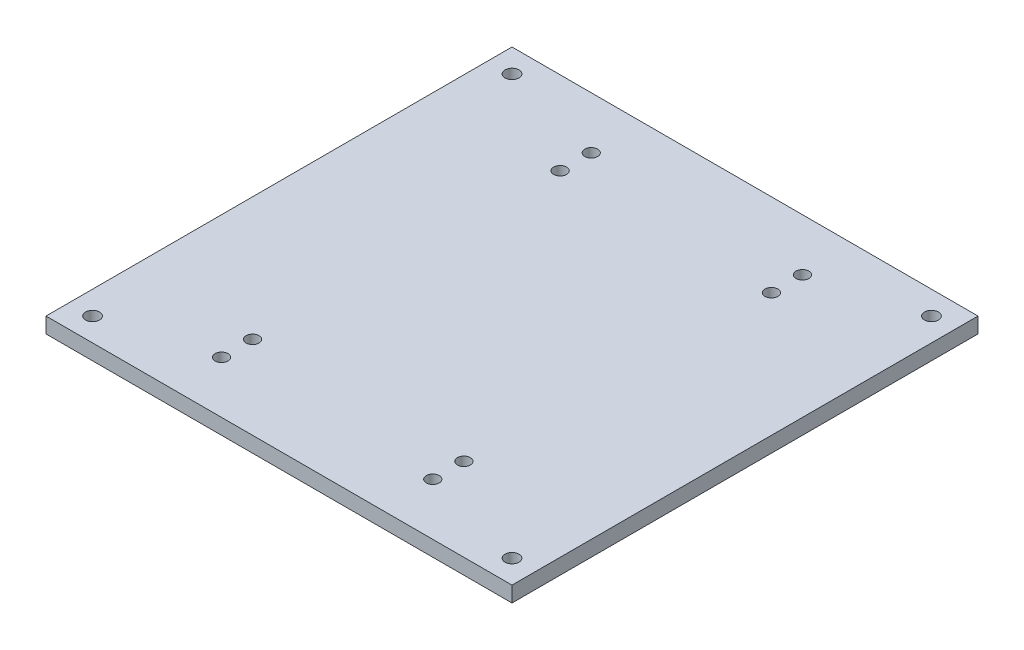
ISO-10303-21;
HEADER;
FILE_DESCRIPTION(('STEP AP214'),'2;1');
FILE_NAME('part.step','',(''),(''),'','','');
FILE_SCHEMA(('AUTOMOTIVE_DESIGN { 1 0 10303 214 1 1 1 1 }'));
ENDSEC;
DATA;
#1=APPLICATION_CONTEXT('core data for automotive mechanical design processes');
#2=APPLICATION_PROTOCOL_DEFINITION('international standard','automotive_design',2000,#1);
#3=PRODUCT_CONTEXT('',#1,'mechanical');
#4=PRODUCT('Part','Part','',(#3));
#5=PRODUCT_RELATED_PRODUCT_CATEGORY('part','',(#4));
#6=PRODUCT_DEFINITION_FORMATION('','',#4);
#7=PRODUCT_DEFINITION_CONTEXT('part definition',#1,'design');
#8=PRODUCT_DEFINITION('design','',#6,#7);
#9=PRODUCT_DEFINITION_SHAPE('','',#8);
#10=(LENGTH_UNIT() NAMED_UNIT(*) SI_UNIT(.MILLI.,.METRE.));
#11=(NAMED_UNIT(*) PLANE_ANGLE_UNIT() SI_UNIT($,.RADIAN.));
#12=(NAMED_UNIT(*) SI_UNIT($,.STERADIAN.) SOLID_ANGLE_UNIT());
#13=UNCERTAINTY_MEASURE_WITH_UNIT(LENGTH_MEASURE(1.E-05),#10,'distance_accuracy_value','');
#14=(GEOMETRIC_REPRESENTATION_CONTEXT(3) GLOBAL_UNCERTAINTY_ASSIGNED_CONTEXT((#13)) GLOBAL_UNIT_ASSIGNED_CONTEXT((#10,
#11,#12)) REPRESENTATION_CONTEXT('',''));
#15=CARTESIAN_POINT('',(0.,0.,0.));
#16=DIRECTION('',(0.,0.,1.));
#17=DIRECTION('',(1.,0.,0.));
#18=AXIS2_PLACEMENT_3D('',#15,#16,#17);
#19=CARTESIAN_POINT('',(-150.,10.,-150.));
#20=DIRECTION('',(1.,0.,0.));
#21=DIRECTION('',(0.,0.,-1.));
#22=AXIS2_PLACEMENT_3D('',#19,#20,#21);
#23=PLANE('',#22);
#24=DIRECTION('',(0.,0.,1.));
#25=VECTOR('',#24,1.);
#26=CARTESIAN_POINT('',(-150.,0.,-150.));
#27=LINE('',#26,#25);
#28=CARTESIAN_POINT('',(-150.,0.,-150.));
#29=VERTEX_POINT('',#28);
#30=CARTESIAN_POINT('',(-150.,0.,150.));
#31=VERTEX_POINT('',#30);
#32=EDGE_CURVE('E106',#29,#31,#27,.T.);
#33=ORIENTED_EDGE('',*,*,#32,.T.);
#34=DIRECTION('',(0.,-1.,0.));
#35=VECTOR('',#34,1.);
#36=CARTESIAN_POINT('',(-150.,10.,150.));
#37=LINE('',#36,#35);
#38=CARTESIAN_POINT('',(-150.,10.,150.));
#39=VERTEX_POINT('',#38);
#40=EDGE_CURVE('E11',#39,#31,#37,.T.);
#41=ORIENTED_EDGE('',*,*,#40,.F.);
#42=DIRECTION('',(0.,0.,1.));
#43=VECTOR('',#42,1.);
#44=CARTESIAN_POINT('',(-150.,10.,-150.));
#45=LINE('',#44,#43);
#46=CARTESIAN_POINT('',(-150.,10.,-150.));
#47=VERTEX_POINT('',#46);
#48=EDGE_CURVE('E94',#47,#39,#45,.T.);
#49=ORIENTED_EDGE('',*,*,#48,.F.);
#50=DIRECTION('',(0.,-1.,0.));
#51=VECTOR('',#50,1.);
#52=CARTESIAN_POINT('',(-150.,10.,-150.));
#53=LINE('',#52,#51);
#54=EDGE_CURVE('E102',#47,#29,#53,.T.);
#55=ORIENTED_EDGE('',*,*,#54,.T.);
#56=EDGE_LOOP('',(#33,#41,#49,#55));
#57=FACE_BOUND('',#56,.T.);
#58=ADVANCED_FACE('F43',(#57),#23,.F.);
#59=CARTESIAN_POINT('',(-150.,10.,150.));
#60=DIRECTION('',(0.,0.,-1.));
#61=DIRECTION('',(-1.,0.,0.));
#62=AXIS2_PLACEMENT_3D('',#59,#60,#61);
#63=PLANE('',#62);
#64=DIRECTION('',(1.,0.,0.));
#65=VECTOR('',#64,1.);
#66=CARTESIAN_POINT('',(-150.,0.,150.));
#67=LINE('',#66,#65);
#68=CARTESIAN_POINT('',(150.,0.,150.));
#69=VERTEX_POINT('',#68);
#70=EDGE_CURVE('E98',#31,#69,#67,.T.);
#71=ORIENTED_EDGE('',*,*,#70,.T.);
#72=DIRECTION('',(0.,-1.,0.));
#73=VECTOR('',#72,1.);
#74=CARTESIAN_POINT('',(150.,10.,150.));
#75=LINE('',#74,#73);
#76=CARTESIAN_POINT('',(150.,10.,150.));
#77=VERTEX_POINT('',#76);
#78=EDGE_CURVE('E51',#77,#69,#75,.T.);
#79=ORIENTED_EDGE('',*,*,#78,.F.);
#80=DIRECTION('',(1.,0.,0.));
#81=VECTOR('',#80,1.);
#82=CARTESIAN_POINT('',(-150.,10.,150.));
#83=LINE('',#82,#81);
#84=EDGE_CURVE('E89',#39,#77,#83,.T.);
#85=ORIENTED_EDGE('',*,*,#84,.F.);
#86=ORIENTED_EDGE('',*,*,#40,.T.);
#87=EDGE_LOOP('',(#71,#79,#85,#86));
#88=FACE_BOUND('',#87,.T.);
#89=ADVANCED_FACE('F97',(#88),#63,.F.);
#90=CARTESIAN_POINT('',(150.,10.,-150.));
#91=DIRECTION('',(-1.,0.,0.));
#92=DIRECTION('',(0.,0.,1.));
#93=AXIS2_PLACEMENT_3D('',#90,#91,#92);
#94=PLANE('',#93);
#95=DIRECTION('',(0.,0.,-1.));
#96=VECTOR('',#95,1.);
#97=CARTESIAN_POINT('',(150.,0.,-150.));
#98=LINE('',#97,#96);
#99=CARTESIAN_POINT('',(150.,0.,-150.));
#100=VERTEX_POINT('',#99);
#101=EDGE_CURVE('E76',#69,#100,#98,.T.);
#102=ORIENTED_EDGE('',*,*,#101,.T.);
#103=DIRECTION('',(0.,-1.,0.));
#104=VECTOR('',#103,1.);
#105=CARTESIAN_POINT('',(150.,10.,-150.));
#106=LINE('',#105,#104);
#107=CARTESIAN_POINT('',(150.,10.,-150.));
#108=VERTEX_POINT('',#107);
#109=EDGE_CURVE('E99',#108,#100,#106,.T.);
#110=ORIENTED_EDGE('',*,*,#109,.F.);
#111=DIRECTION('',(0.,0.,-1.));
#112=VECTOR('',#111,1.);
#113=CARTESIAN_POINT('',(150.,10.,-150.));
#114=LINE('',#113,#112);
#115=EDGE_CURVE('E92',#77,#108,#114,.T.);
#116=ORIENTED_EDGE('',*,*,#115,.F.);
#117=ORIENTED_EDGE('',*,*,#78,.T.);
#118=EDGE_LOOP('',(#102,#110,#116,#117));
#119=FACE_BOUND('',#118,.T.);
#120=ADVANCED_FACE('F100',(#119),#94,.F.);
#121=CARTESIAN_POINT('',(-150.,10.,-150.));
#122=DIRECTION('',(0.,0.,1.));
#123=DIRECTION('',(1.,0.,0.));
#124=AXIS2_PLACEMENT_3D('',#121,#122,#123);
#125=PLANE('',#124);
#126=DIRECTION('',(-1.,0.,0.));
#127=VECTOR('',#126,1.);
#128=CARTESIAN_POINT('',(-150.,0.,-150.));
#129=LINE('',#128,#127);
#130=EDGE_CURVE('E82',#100,#29,#129,.T.);
#131=ORIENTED_EDGE('',*,*,#130,.T.);
#132=ORIENTED_EDGE('',*,*,#54,.F.);
#133=DIRECTION('',(-1.,0.,0.));
#134=VECTOR('',#133,1.);
#135=CARTESIAN_POINT('',(-150.,10.,-150.));
#136=LINE('',#135,#134);
#137=EDGE_CURVE('E59',#108,#47,#136,.T.);
#138=ORIENTED_EDGE('',*,*,#137,.F.);
#139=ORIENTED_EDGE('',*,*,#109,.T.);
#140=EDGE_LOOP('',(#131,#132,#138,#139));
#141=FACE_BOUND('',#140,.T.);
#142=ADVANCED_FACE('F114',(#141),#125,.F.);
#143=CARTESIAN_POINT('',(0.,10.,0.));
#144=DIRECTION('',(0.,1.,0.));
#145=DIRECTION('',(0.,0.,1.));
#146=AXIS2_PLACEMENT_3D('',#143,#144,#145);
#147=PLANE('',#146);
#148=CARTESIAN_POINT('',(-135.,10.,135.));
#149=DIRECTION('',(0.,1.,0.));
#150=DIRECTION('',(0.,0.,1.));
#151=AXIS2_PLACEMENT_3D('',#148,#149,#150);
#152=CIRCLE('',#151,4.5);
#153=CARTESIAN_POINT('',(-135.,10.,139.5));
#154=VERTEX_POINT('',#153);
#155=EDGE_CURVE('E188',#154,#154,#152,.T.);
#156=ORIENTED_EDGE('',*,*,#155,.F.);
#157=EDGE_LOOP('',(#156));
#158=FACE_BOUND('',#157,.T.);
#159=CARTESIAN_POINT('',(-135.,10.,-135.));
#160=DIRECTION('',(0.,1.,0.));
#161=DIRECTION('',(0.,0.,1.));
#162=AXIS2_PLACEMENT_3D('',#159,#160,#161);
#163=CIRCLE('',#162,4.5);
#164=CARTESIAN_POINT('',(-135.,10.,-130.5));
#165=VERTEX_POINT('',#164);
#166=EDGE_CURVE('E182',#165,#165,#163,.T.);
#167=ORIENTED_EDGE('',*,*,#166,.F.);
#168=EDGE_LOOP('',(#167));
#169=FACE_BOUND('',#168,.T.);
#170=CARTESIAN_POINT('',(135.,10.,-135.));
#171=DIRECTION('',(0.,1.,0.));
#172=DIRECTION('',(0.,0.,1.));
#173=AXIS2_PLACEMENT_3D('',#170,#171,#172);
#174=CIRCLE('',#173,4.5);
#175=CARTESIAN_POINT('',(135.,10.,-130.5));
#176=VERTEX_POINT('',#175);
#177=EDGE_CURVE('E176',#176,#176,#174,.T.);
#178=ORIENTED_EDGE('',*,*,#177,.F.);
#179=EDGE_LOOP('',(#178));
#180=FACE_BOUND('',#179,.T.);
#181=CARTESIAN_POINT('',(135.,10.,135.));
#182=DIRECTION('',(0.,1.,0.));
#183=DIRECTION('',(0.,0.,1.));
#184=AXIS2_PLACEMENT_3D('',#181,#182,#183);
#185=CIRCLE('',#184,4.5);
#186=CARTESIAN_POINT('',(135.,10.,139.5));
#187=VERTEX_POINT('',#186);
#188=EDGE_CURVE('E170',#187,#187,#185,.T.);
#189=ORIENTED_EDGE('',*,*,#188,.F.);
#190=EDGE_LOOP('',(#189));
#191=FACE_BOUND('',#190,.T.);
#192=CARTESIAN_POINT('',(70.5,10.,-116.5));
#193=DIRECTION('',(0.,1.,0.));
#194=DIRECTION('',(0.,0.,1.));
#195=AXIS2_PLACEMENT_3D('',#192,#193,#194);
#196=CIRCLE('',#195,4.14999999999999);
#197=CARTESIAN_POINT('',(70.5,10.,-112.35));
#198=VERTEX_POINT('',#197);
#199=EDGE_CURVE('E164',#198,#198,#196,.T.);
#200=ORIENTED_EDGE('',*,*,#199,.F.);
#201=EDGE_LOOP('',(#200));
#202=FACE_BOUND('',#201,.T.);
#203=CARTESIAN_POINT('',(70.5,10.,-96.5000000000002));
#204=DIRECTION('',(0.,1.,0.));
#205=DIRECTION('',(0.,0.,1.));
#206=AXIS2_PLACEMENT_3D('',#203,#204,#205);
#207=CIRCLE('',#206,4.14999999999999);
#208=CARTESIAN_POINT('',(70.5,10.,-92.3500000000002));
#209=VERTEX_POINT('',#208);
#210=EDGE_CURVE('E158',#209,#209,#207,.T.);
#211=ORIENTED_EDGE('',*,*,#210,.F.);
#212=EDGE_LOOP('',(#211));
#213=FACE_BOUND('',#212,.T.);
#214=CARTESIAN_POINT('',(65.5,10.,96.4999999999988));
#215=DIRECTION('',(0.,1.,0.));
#216=DIRECTION('',(0.,0.,1.));
#217=AXIS2_PLACEMENT_3D('',#214,#215,#216);
#218=CIRCLE('',#217,4.14999999999999);
#219=CARTESIAN_POINT('',(65.5,10.,100.649999999999));
#220=VERTEX_POINT('',#219);
#221=EDGE_CURVE('E152',#220,#220,#218,.T.);
#222=ORIENTED_EDGE('',*,*,#221,.F.);
#223=EDGE_LOOP('',(#222));
#224=FACE_BOUND('',#223,.T.);
#225=CARTESIAN_POINT('',(65.5,10.,116.499999999999));
#226=DIRECTION('',(0.,1.,0.));
#227=DIRECTION('',(0.,0.,1.));
#228=AXIS2_PLACEMENT_3D('',#225,#226,#227);
#229=CIRCLE('',#228,4.14999999999999);
#230=CARTESIAN_POINT('',(65.5,10.,120.649999999999));
#231=VERTEX_POINT('',#230);
#232=EDGE_CURVE('E146',#231,#231,#229,.T.);
#233=ORIENTED_EDGE('',*,*,#232,.F.);
#234=EDGE_LOOP('',(#233));
#235=FACE_BOUND('',#234,.T.);
#236=CARTESIAN_POINT('',(-65.5000000000008,10.,-116.500000000002));
#237=DIRECTION('',(0.,1.,0.));
#238=DIRECTION('',(0.,0.,1.));
#239=AXIS2_PLACEMENT_3D('',#236,#237,#238);
#240=CIRCLE('',#239,4.14999999999999);
#241=CARTESIAN_POINT('',(-65.5000000000008,10.,-112.350000000002));
#242=VERTEX_POINT('',#241);
#243=EDGE_CURVE('E140',#242,#242,#240,.T.);
#244=ORIENTED_EDGE('',*,*,#243,.F.);
#245=EDGE_LOOP('',(#244));
#246=FACE_BOUND('',#245,.T.);
#247=CARTESIAN_POINT('',(-65.5000000000007,10.,-96.500000000002));
#248=DIRECTION('',(0.,1.,0.));
#249=DIRECTION('',(0.,0.,1.));
#250=AXIS2_PLACEMENT_3D('',#247,#248,#249);
#251=CIRCLE('',#250,4.14999999999999);
#252=CARTESIAN_POINT('',(-65.5000000000007,10.,-92.3500000000021));
#253=VERTEX_POINT('',#252);
#254=EDGE_CURVE('E134',#253,#253,#251,.T.);
#255=ORIENTED_EDGE('',*,*,#254,.F.);
#256=EDGE_LOOP('',(#255));
#257=FACE_BOUND('',#256,.T.);
#258=CARTESIAN_POINT('',(-70.4999999999993,10.,96.4999999999969));
#259=DIRECTION('',(0.,1.,0.));
#260=DIRECTION('',(0.,0.,1.));
#261=AXIS2_PLACEMENT_3D('',#258,#259,#260);
#262=CIRCLE('',#261,4.14999999999999);
#263=CARTESIAN_POINT('',(-70.4999999999993,10.,100.649999999997));
#264=VERTEX_POINT('',#263);
#265=EDGE_CURVE('E128',#264,#264,#262,.T.);
#266=ORIENTED_EDGE('',*,*,#265,.F.);
#267=EDGE_LOOP('',(#266));
#268=FACE_BOUND('',#267,.T.);
#269=CARTESIAN_POINT('',(-70.4999999999992,10.,116.499999999997));
#270=DIRECTION('',(0.,1.,0.));
#271=DIRECTION('',(0.,0.,1.));
#272=AXIS2_PLACEMENT_3D('',#269,#270,#271);
#273=CIRCLE('',#272,4.14999999999999);
#274=CARTESIAN_POINT('',(-70.4999999999992,10.,120.649999999997));
#275=VERTEX_POINT('',#274);
#276=EDGE_CURVE('E122',#275,#275,#273,.T.);
#277=ORIENTED_EDGE('',*,*,#276,.F.);
#278=EDGE_LOOP('',(#277));
#279=FACE_BOUND('',#278,.T.);
#280=ORIENTED_EDGE('',*,*,#48,.T.);
#281=ORIENTED_EDGE('',*,*,#84,.T.);
#282=ORIENTED_EDGE('',*,*,#115,.T.);
#283=ORIENTED_EDGE('',*,*,#137,.T.);
#284=EDGE_LOOP('',(#280,#281,#282,#283));
#285=FACE_BOUND('',#284,.T.);
#286=ADVANCED_FACE('F90',(#158,#169,#180,#191,#202,#213,#224,#235,#246,#257,#268,#279,#285),
#147,.T.);
#287=CARTESIAN_POINT('',(0.,0.,0.));
#288=DIRECTION('',(0.,1.,0.));
#289=DIRECTION('',(0.,0.,1.));
#290=AXIS2_PLACEMENT_3D('',#287,#288,#289);
#291=PLANE('',#290);
#292=CARTESIAN_POINT('',(-135.,0.,135.));
#293=DIRECTION('',(0.,1.,0.));
#294=DIRECTION('',(0.,0.,1.));
#295=AXIS2_PLACEMENT_3D('',#292,#293,#294);
#296=CIRCLE('',#295,4.5);
#297=CARTESIAN_POINT('',(-135.,0.,139.5));
#298=VERTEX_POINT('',#297);
#299=EDGE_CURVE('E185',#298,#298,#296,.T.);
#300=ORIENTED_EDGE('',*,*,#299,.T.);
#301=EDGE_LOOP('',(#300));
#302=FACE_BOUND('',#301,.T.);
#303=CARTESIAN_POINT('',(-135.,0.,-135.));
#304=DIRECTION('',(0.,1.,0.));
#305=DIRECTION('',(0.,0.,1.));
#306=AXIS2_PLACEMENT_3D('',#303,#304,#305);
#307=CIRCLE('',#306,4.5);
#308=CARTESIAN_POINT('',(-135.,0.,-130.5));
#309=VERTEX_POINT('',#308);
#310=EDGE_CURVE('E179',#309,#309,#307,.T.);
#311=ORIENTED_EDGE('',*,*,#310,.T.);
#312=EDGE_LOOP('',(#311));
#313=FACE_BOUND('',#312,.T.);
#314=CARTESIAN_POINT('',(135.,0.,-135.));
#315=DIRECTION('',(0.,1.,0.));
#316=DIRECTION('',(0.,0.,1.));
#317=AXIS2_PLACEMENT_3D('',#314,#315,#316);
#318=CIRCLE('',#317,4.5);
#319=CARTESIAN_POINT('',(135.,0.,-130.5));
#320=VERTEX_POINT('',#319);
#321=EDGE_CURVE('E173',#320,#320,#318,.T.);
#322=ORIENTED_EDGE('',*,*,#321,.T.);
#323=EDGE_LOOP('',(#322));
#324=FACE_BOUND('',#323,.T.);
#325=CARTESIAN_POINT('',(135.,0.,135.));
#326=DIRECTION('',(0.,1.,0.));
#327=DIRECTION('',(0.,0.,1.));
#328=AXIS2_PLACEMENT_3D('',#325,#326,#327);
#329=CIRCLE('',#328,4.5);
#330=CARTESIAN_POINT('',(135.,0.,139.5));
#331=VERTEX_POINT('',#330);
#332=EDGE_CURVE('E167',#331,#331,#329,.T.);
#333=ORIENTED_EDGE('',*,*,#332,.T.);
#334=EDGE_LOOP('',(#333));
#335=FACE_BOUND('',#334,.T.);
#336=CARTESIAN_POINT('',(70.5,0.,-116.5));
#337=DIRECTION('',(0.,1.,0.));
#338=DIRECTION('',(0.,0.,1.));
#339=AXIS2_PLACEMENT_3D('',#336,#337,#338);
#340=CIRCLE('',#339,4.15);
#341=CARTESIAN_POINT('',(70.5,0.,-112.35));
#342=VERTEX_POINT('',#341);
#343=EDGE_CURVE('E161',#342,#342,#340,.T.);
#344=ORIENTED_EDGE('',*,*,#343,.T.);
#345=EDGE_LOOP('',(#344));
#346=FACE_BOUND('',#345,.T.);
#347=CARTESIAN_POINT('',(70.5,0.,-96.5000000000002));
#348=DIRECTION('',(0.,1.,0.));
#349=DIRECTION('',(0.,0.,1.));
#350=AXIS2_PLACEMENT_3D('',#347,#348,#349);
#351=CIRCLE('',#350,4.15);
#352=CARTESIAN_POINT('',(70.5,0.,-92.3500000000002));
#353=VERTEX_POINT('',#352);
#354=EDGE_CURVE('E155',#353,#353,#351,.T.);
#355=ORIENTED_EDGE('',*,*,#354,.T.);
#356=EDGE_LOOP('',(#355));
#357=FACE_BOUND('',#356,.T.);
#358=CARTESIAN_POINT('',(65.5,0.,96.4999999999988));
#359=DIRECTION('',(0.,1.,0.));
#360=DIRECTION('',(0.,0.,1.));
#361=AXIS2_PLACEMENT_3D('',#358,#359,#360);
#362=CIRCLE('',#361,4.15);
#363=CARTESIAN_POINT('',(65.5,0.,100.649999999999));
#364=VERTEX_POINT('',#363);
#365=EDGE_CURVE('E149',#364,#364,#362,.T.);
#366=ORIENTED_EDGE('',*,*,#365,.T.);
#367=EDGE_LOOP('',(#366));
#368=FACE_BOUND('',#367,.T.);
#369=CARTESIAN_POINT('',(65.5,0.,116.499999999999));
#370=DIRECTION('',(0.,1.,0.));
#371=DIRECTION('',(0.,0.,1.));
#372=AXIS2_PLACEMENT_3D('',#369,#370,#371);
#373=CIRCLE('',#372,4.15);
#374=CARTESIAN_POINT('',(65.5,0.,120.649999999999));
#375=VERTEX_POINT('',#374);
#376=EDGE_CURVE('E143',#375,#375,#373,.T.);
#377=ORIENTED_EDGE('',*,*,#376,.T.);
#378=EDGE_LOOP('',(#377));
#379=FACE_BOUND('',#378,.T.);
#380=CARTESIAN_POINT('',(-65.5000000000008,0.,-116.500000000002));
#381=DIRECTION('',(0.,1.,0.));
#382=DIRECTION('',(0.,0.,1.));
#383=AXIS2_PLACEMENT_3D('',#380,#381,#382);
#384=CIRCLE('',#383,4.14999999999999);
#385=CARTESIAN_POINT('',(-65.5000000000008,0.,-112.350000000002));
#386=VERTEX_POINT('',#385);
#387=EDGE_CURVE('E137',#386,#386,#384,.T.);
#388=ORIENTED_EDGE('',*,*,#387,.T.);
#389=EDGE_LOOP('',(#388));
#390=FACE_BOUND('',#389,.T.);
#391=CARTESIAN_POINT('',(-65.5000000000007,0.,-96.500000000002));
#392=DIRECTION('',(0.,1.,0.));
#393=DIRECTION('',(0.,0.,1.));
#394=AXIS2_PLACEMENT_3D('',#391,#392,#393);
#395=CIRCLE('',#394,4.14999999999999);
#396=CARTESIAN_POINT('',(-65.5000000000007,0.,-92.350000000002));
#397=VERTEX_POINT('',#396);
#398=EDGE_CURVE('E131',#397,#397,#395,.T.);
#399=ORIENTED_EDGE('',*,*,#398,.T.);
#400=EDGE_LOOP('',(#399));
#401=FACE_BOUND('',#400,.T.);
#402=CARTESIAN_POINT('',(-70.4999999999993,0.,96.4999999999969));
#403=DIRECTION('',(0.,1.,0.));
#404=DIRECTION('',(0.,0.,1.));
#405=AXIS2_PLACEMENT_3D('',#402,#403,#404);
#406=CIRCLE('',#405,4.15);
#407=CARTESIAN_POINT('',(-70.4999999999993,0.,100.649999999997));
#408=VERTEX_POINT('',#407);
#409=EDGE_CURVE('E125',#408,#408,#406,.T.);
#410=ORIENTED_EDGE('',*,*,#409,.T.);
#411=EDGE_LOOP('',(#410));
#412=FACE_BOUND('',#411,.T.);
#413=CARTESIAN_POINT('',(-70.4999999999992,0.,116.499999999997));
#414=DIRECTION('',(0.,1.,0.));
#415=DIRECTION('',(0.,0.,1.));
#416=AXIS2_PLACEMENT_3D('',#413,#414,#415);
#417=CIRCLE('',#416,4.15);
#418=CARTESIAN_POINT('',(-70.4999999999992,0.,120.649999999997));
#419=VERTEX_POINT('',#418);
#420=EDGE_CURVE('E109',#419,#419,#417,.T.);
#421=ORIENTED_EDGE('',*,*,#420,.T.);
#422=EDGE_LOOP('',(#421));
#423=FACE_BOUND('',#422,.T.);
#424=ORIENTED_EDGE('',*,*,#32,.F.);
#425=ORIENTED_EDGE('',*,*,#130,.F.);
#426=ORIENTED_EDGE('',*,*,#101,.F.);
#427=ORIENTED_EDGE('',*,*,#70,.F.);
#428=EDGE_LOOP('',(#424,#425,#426,#427));
#429=FACE_BOUND('',#428,.T.);
#430=ADVANCED_FACE('F117',(#302,#313,#324,#335,#346,#357,#368,#379,#390,#401,#412,#423,#429),
#291,.F.);
#431=CARTESIAN_POINT('',(-70.4999999999992,10.,116.499999999997));
#432=DIRECTION('',(0.,1.,0.));
#433=DIRECTION('',(0.,0.,1.));
#434=AXIS2_PLACEMENT_3D('',#431,#432,#433);
#435=CYLINDRICAL_SURFACE('',#434,4.14999999999999);
#436=ORIENTED_EDGE('',*,*,#420,.F.);
#437=EDGE_LOOP('',(#436));
#438=FACE_BOUND('',#437,.T.);
#439=ORIENTED_EDGE('',*,*,#276,.T.);
#440=EDGE_LOOP('',(#439));
#441=FACE_BOUND('',#440,.T.);
#442=ADVANCED_FACE('F219',(#438,#441),#435,.F.);
#443=CARTESIAN_POINT('',(-70.4999999999993,10.,96.4999999999969));
#444=DIRECTION('',(0.,1.,0.));
#445=DIRECTION('',(0.,0.,1.));
#446=AXIS2_PLACEMENT_3D('',#443,#444,#445);
#447=CYLINDRICAL_SURFACE('',#446,4.14999999999999);
#448=ORIENTED_EDGE('',*,*,#409,.F.);
#449=EDGE_LOOP('',(#448));
#450=FACE_BOUND('',#449,.T.);
#451=ORIENTED_EDGE('',*,*,#265,.T.);
#452=EDGE_LOOP('',(#451));
#453=FACE_BOUND('',#452,.T.);
#454=ADVANCED_FACE('F221',(#450,#453),#447,.F.);
#455=CARTESIAN_POINT('',(-65.5000000000007,10.,-96.500000000002));
#456=DIRECTION('',(0.,1.,0.));
#457=DIRECTION('',(0.,0.,1.));
#458=AXIS2_PLACEMENT_3D('',#455,#456,#457);
#459=CYLINDRICAL_SURFACE('',#458,4.14999999999999);
#460=ORIENTED_EDGE('',*,*,#398,.F.);
#461=EDGE_LOOP('',(#460));
#462=FACE_BOUND('',#461,.T.);
#463=ORIENTED_EDGE('',*,*,#254,.T.);
#464=EDGE_LOOP('',(#463));
#465=FACE_BOUND('',#464,.T.);
#466=ADVANCED_FACE('F228',(#462,#465),#459,.F.);
#467=CARTESIAN_POINT('',(-65.5000000000008,10.,-116.500000000002));
#468=DIRECTION('',(0.,1.,0.));
#469=DIRECTION('',(0.,0.,1.));
#470=AXIS2_PLACEMENT_3D('',#467,#468,#469);
#471=CYLINDRICAL_SURFACE('',#470,4.14999999999999);
#472=ORIENTED_EDGE('',*,*,#387,.F.);
#473=EDGE_LOOP('',(#472));
#474=FACE_BOUND('',#473,.T.);
#475=ORIENTED_EDGE('',*,*,#243,.T.);
#476=EDGE_LOOP('',(#475));
#477=FACE_BOUND('',#476,.T.);
#478=ADVANCED_FACE('F322',(#474,#477),#471,.F.);
#479=CARTESIAN_POINT('',(65.5,10.,116.499999999999));
#480=DIRECTION('',(0.,1.,0.));
#481=DIRECTION('',(0.,0.,1.));
#482=AXIS2_PLACEMENT_3D('',#479,#480,#481);
#483=CYLINDRICAL_SURFACE('',#482,4.14999999999999);
#484=ORIENTED_EDGE('',*,*,#376,.F.);
#485=EDGE_LOOP('',(#484));
#486=FACE_BOUND('',#485,.T.);
#487=ORIENTED_EDGE('',*,*,#232,.T.);
#488=EDGE_LOOP('',(#487));
#489=FACE_BOUND('',#488,.T.);
#490=ADVANCED_FACE('F318',(#486,#489),#483,.F.);
#491=CARTESIAN_POINT('',(65.5,10.,96.4999999999988));
#492=DIRECTION('',(0.,1.,0.));
#493=DIRECTION('',(0.,0.,1.));
#494=AXIS2_PLACEMENT_3D('',#491,#492,#493);
#495=CYLINDRICAL_SURFACE('',#494,4.14999999999999);
#496=ORIENTED_EDGE('',*,*,#365,.F.);
#497=EDGE_LOOP('',(#496));
#498=FACE_BOUND('',#497,.T.);
#499=ORIENTED_EDGE('',*,*,#221,.T.);
#500=EDGE_LOOP('',(#499));
#501=FACE_BOUND('',#500,.T.);
#502=ADVANCED_FACE('F314',(#498,#501),#495,.F.);
#503=CARTESIAN_POINT('',(70.5,10.,-96.5000000000002));
#504=DIRECTION('',(0.,1.,0.));
#505=DIRECTION('',(0.,0.,1.));
#506=AXIS2_PLACEMENT_3D('',#503,#504,#505);
#507=CYLINDRICAL_SURFACE('',#506,4.14999999999999);
#508=ORIENTED_EDGE('',*,*,#354,.F.);
#509=EDGE_LOOP('',(#508));
#510=FACE_BOUND('',#509,.T.);
#511=ORIENTED_EDGE('',*,*,#210,.T.);
#512=EDGE_LOOP('',(#511));
#513=FACE_BOUND('',#512,.T.);
#514=ADVANCED_FACE('F310',(#510,#513),#507,.F.);
#515=CARTESIAN_POINT('',(70.5,10.,-116.5));
#516=DIRECTION('',(0.,1.,0.));
#517=DIRECTION('',(0.,0.,1.));
#518=AXIS2_PLACEMENT_3D('',#515,#516,#517);
#519=CYLINDRICAL_SURFACE('',#518,4.14999999999999);
#520=ORIENTED_EDGE('',*,*,#343,.F.);
#521=EDGE_LOOP('',(#520));
#522=FACE_BOUND('',#521,.T.);
#523=ORIENTED_EDGE('',*,*,#199,.T.);
#524=EDGE_LOOP('',(#523));
#525=FACE_BOUND('',#524,.T.);
#526=ADVANCED_FACE('F272',(#522,#525),#519,.F.);
#527=CARTESIAN_POINT('',(135.,10.,135.));
#528=DIRECTION('',(0.,1.,0.));
#529=DIRECTION('',(0.,0.,1.));
#530=AXIS2_PLACEMENT_3D('',#527,#528,#529);
#531=CYLINDRICAL_SURFACE('',#530,4.5);
#532=ORIENTED_EDGE('',*,*,#332,.F.);
#533=EDGE_LOOP('',(#532));
#534=FACE_BOUND('',#533,.T.);
#535=ORIENTED_EDGE('',*,*,#188,.T.);
#536=EDGE_LOOP('',(#535));
#537=FACE_BOUND('',#536,.T.);
#538=ADVANCED_FACE('F266',(#534,#537),#531,.F.);
#539=CARTESIAN_POINT('',(135.,10.,-135.));
#540=DIRECTION('',(0.,1.,0.));
#541=DIRECTION('',(0.,0.,1.));
#542=AXIS2_PLACEMENT_3D('',#539,#540,#541);
#543=CYLINDRICAL_SURFACE('',#542,4.5);
#544=ORIENTED_EDGE('',*,*,#321,.F.);
#545=EDGE_LOOP('',(#544));
#546=FACE_BOUND('',#545,.T.);
#547=ORIENTED_EDGE('',*,*,#177,.T.);
#548=EDGE_LOOP('',(#547));
#549=FACE_BOUND('',#548,.T.);
#550=ADVANCED_FACE('F271',(#546,#549),#543,.F.);
#551=CARTESIAN_POINT('',(-135.,10.,-135.));
#552=DIRECTION('',(0.,1.,0.));
#553=DIRECTION('',(0.,0.,1.));
#554=AXIS2_PLACEMENT_3D('',#551,#552,#553);
#555=CYLINDRICAL_SURFACE('',#554,4.5);
#556=ORIENTED_EDGE('',*,*,#310,.F.);
#557=EDGE_LOOP('',(#556));
#558=FACE_BOUND('',#557,.T.);
#559=ORIENTED_EDGE('',*,*,#166,.T.);
#560=EDGE_LOOP('',(#559));
#561=FACE_BOUND('',#560,.T.);
#562=ADVANCED_FACE('F284',(#558,#561),#555,.F.);
#563=CARTESIAN_POINT('',(-135.,10.,135.));
#564=DIRECTION('',(0.,1.,0.));
#565=DIRECTION('',(0.,0.,1.));
#566=AXIS2_PLACEMENT_3D('',#563,#564,#565);
#567=CYLINDRICAL_SURFACE('',#566,4.5);
#568=ORIENTED_EDGE('',*,*,#299,.F.);
#569=EDGE_LOOP('',(#568));
#570=FACE_BOUND('',#569,.T.);
#571=ORIENTED_EDGE('',*,*,#155,.T.);
#572=EDGE_LOOP('',(#571));
#573=FACE_BOUND('',#572,.T.);
#574=ADVANCED_FACE('F192',(#570,#573),#567,.F.);
#575=CLOSED_SHELL('',(#58,#89,#120,#142,#286,#430,#442,#454,#466,#478,#490,#502,#514,#526,#538,
#550,#562,#574));
#576=MANIFOLD_SOLID_BREP('B2',#575);
#577=ADVANCED_BREP_SHAPE_REPRESENTATION('',(#18,#576),#14);
#578=SHAPE_DEFINITION_REPRESENTATION(#9,#577);
ENDSEC;
END-ISO-10303-21;
